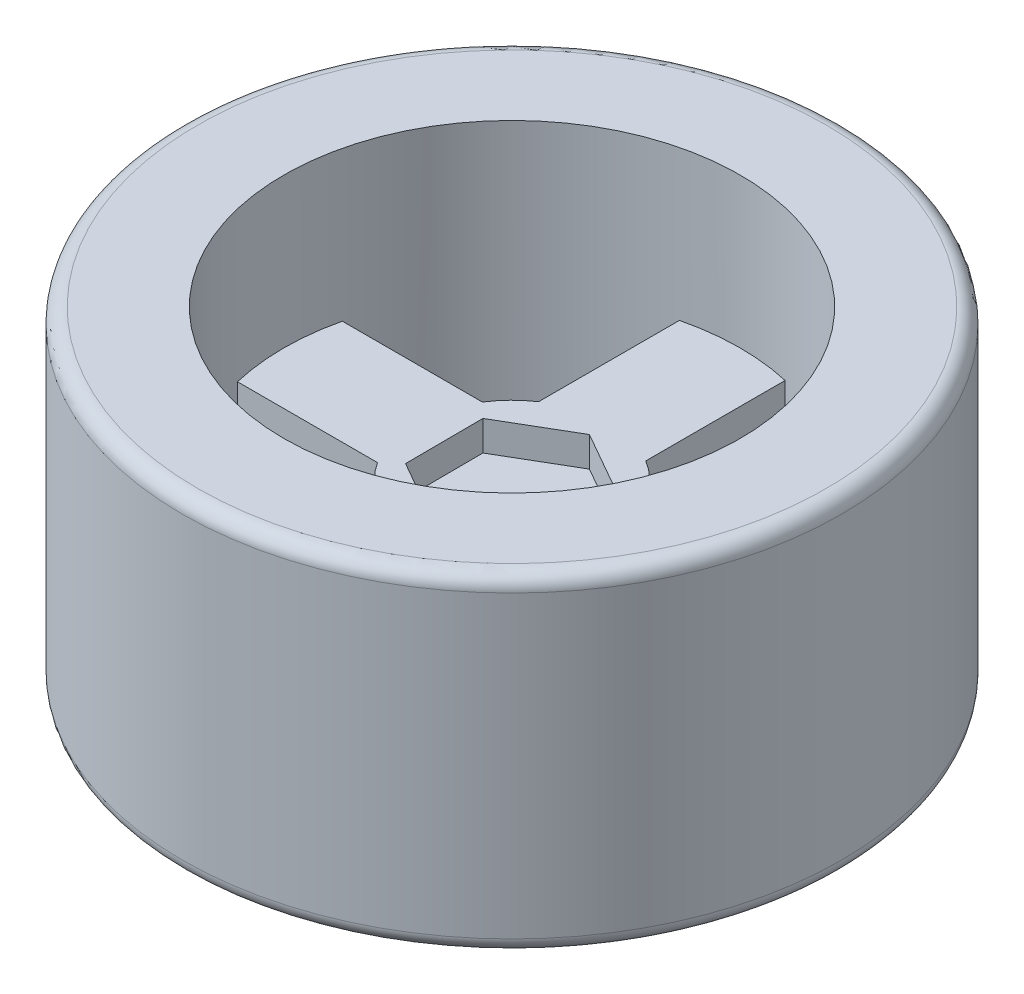
ISO-10303-21;
HEADER;
FILE_DESCRIPTION(('STEP AP214'),'2;1');
FILE_NAME('part.step','',(''),(''),'','','');
FILE_SCHEMA(('AUTOMOTIVE_DESIGN { 1 0 10303 214 1 1 1 1 }'));
ENDSEC;
DATA;
#1=APPLICATION_CONTEXT('core data for automotive mechanical design processes');
#2=APPLICATION_PROTOCOL_DEFINITION('international standard','automotive_design',2000,#1);
#3=PRODUCT_CONTEXT('',#1,'mechanical');
#4=PRODUCT('Part','Part','',(#3));
#5=PRODUCT_RELATED_PRODUCT_CATEGORY('part','',(#4));
#6=PRODUCT_DEFINITION_FORMATION('','',#4);
#7=PRODUCT_DEFINITION_CONTEXT('part definition',#1,'design');
#8=PRODUCT_DEFINITION('design','',#6,#7);
#9=PRODUCT_DEFINITION_SHAPE('','',#8);
#10=(LENGTH_UNIT() NAMED_UNIT(*) SI_UNIT(.MILLI.,.METRE.));
#11=(NAMED_UNIT(*) PLANE_ANGLE_UNIT() SI_UNIT($,.RADIAN.));
#12=(NAMED_UNIT(*) SI_UNIT($,.STERADIAN.) SOLID_ANGLE_UNIT());
#13=UNCERTAINTY_MEASURE_WITH_UNIT(LENGTH_MEASURE(1.E-05),#10,'distance_accuracy_value','');
#14=(GEOMETRIC_REPRESENTATION_CONTEXT(3) GLOBAL_UNCERTAINTY_ASSIGNED_CONTEXT((#13)) GLOBAL_UNIT_ASSIGNED_CONTEXT((#10,
#11,#12)) REPRESENTATION_CONTEXT('',''));
#15=CARTESIAN_POINT('',(0.,0.,0.));
#16=DIRECTION('',(0.,0.,1.));
#17=DIRECTION('',(1.,0.,0.));
#18=AXIS2_PLACEMENT_3D('',#15,#16,#17);
#19=CARTESIAN_POINT('',(-0.0495143622985137,12.,-2.83261216182676));
#20=DIRECTION('',(0.,-1.,0.));
#21=DIRECTION('',(0.,0.,-1.));
#22=AXIS2_PLACEMENT_3D('',#19,#20,#21);
#23=CYLINDRICAL_SURFACE('',#22,1.5);
#24=CARTESIAN_POINT('',(-0.0495143622985137,6.,-2.83261216182676));
#25=DIRECTION('',(0.,-1.,0.));
#26=DIRECTION('',(0.,0.,-1.));
#27=AXIS2_PLACEMENT_3D('',#24,#25,#26);
#28=CIRCLE('',#27,1.5);
#29=CARTESIAN_POINT('',(-0.0495143622985137,6.,-4.33261216182675));
#30=VERTEX_POINT('',#29);
#31=EDGE_CURVE('E268',#30,#30,#28,.F.);
#32=ORIENTED_EDGE('',*,*,#31,.F.);
#33=EDGE_LOOP('',(#32));
#34=FACE_BOUND('',#33,.T.);
#35=CARTESIAN_POINT('',(-0.0495143622985137,10.,-2.83261216182676));
#36=DIRECTION('',(0.,1.,0.));
#37=DIRECTION('',(0.,0.,1.));
#38=AXIS2_PLACEMENT_3D('',#35,#36,#37);
#39=CIRCLE('',#38,1.5);
#40=CARTESIAN_POINT('',(-0.0495143622985137,10.,-1.33261216182676));
#41=VERTEX_POINT('',#40);
#42=EDGE_CURVE('E257',#41,#41,#39,.F.);
#43=ORIENTED_EDGE('',*,*,#42,.F.);
#44=EDGE_LOOP('',(#43));
#45=FACE_BOUND('',#44,.T.);
#46=ADVANCED_FACE('F58',(#34,#45),#23,.F.);
#47=CARTESIAN_POINT('',(-0.0495140644693574,22.,-2.83261242169505));
#48=DIRECTION('',(0.,-1.,0.));
#49=DIRECTION('',(0.,0.,-1.));
#50=AXIS2_PLACEMENT_3D('',#47,#48,#49);
#51=CYLINDRICAL_SURFACE('',#50,15.2360201030998);
#52=DIRECTION('',(0.,-1.,0.));
#53=VECTOR('',#52,1.);
#54=CARTESIAN_POINT('',(14.7790495797042,12.,0.667387838173245));
#55=LINE('',#54,#53);
#56=CARTESIAN_POINT('',(14.7790495797042,12.,0.667387838173245));
#57=VERTEX_POINT('',#56);
#58=CARTESIAN_POINT('',(14.7790495797042,0.,0.667387838173245));
#59=VERTEX_POINT('',#58);
#60=EDGE_CURVE('E340',#57,#59,#55,.T.);
#61=ORIENTED_EDGE('',*,*,#60,.T.);
#62=CARTESIAN_POINT('',(-0.0495140644693574,0.,-2.83261242169505));
#63=DIRECTION('',(0.,1.,0.));
#64=DIRECTION('',(0.,0.,1.));
#65=AXIS2_PLACEMENT_3D('',#62,#63,#64);
#66=CIRCLE('',#65,15.2360201030998);
#67=CARTESIAN_POINT('',(3.32867889200628,0.,12.0241746108662));
#68=VERTEX_POINT('',#67);
#69=EDGE_CURVE('E384',#68,#59,#66,.T.);
#70=ORIENTED_EDGE('',*,*,#69,.F.);
#71=DIRECTION('',(0.,-1.,0.));
#72=VECTOR('',#71,1.);
#73=CARTESIAN_POINT('',(3.32867889200628,12.,12.024174803013));
#74=LINE('',#73,#72);
#75=CARTESIAN_POINT('',(3.32867889200628,12.,12.024174803013));
#76=VERTEX_POINT('',#75);
#77=EDGE_CURVE('E373',#76,#68,#74,.T.);
#78=ORIENTED_EDGE('',*,*,#77,.F.);
#79=CARTESIAN_POINT('',(-0.0495143622985137,12.,-2.83261216182676));
#80=DIRECTION('',(0.,-1.,0.));
#81=DIRECTION('',(0.,0.,-1.));
#82=AXIS2_PLACEMENT_3D('',#79,#80,#81);
#83=CIRCLE('',#82,15.2360201030998);
#84=CARTESIAN_POINT('',(-3.67132110799372,12.,11.9666724316561));
#85=VERTEX_POINT('',#84);
#86=EDGE_CURVE('E281',#76,#85,#83,.T.);
#87=ORIENTED_EDGE('',*,*,#86,.T.);
#88=DIRECTION('',(0.,-1.,0.));
#89=VECTOR('',#88,1.);
#90=CARTESIAN_POINT('',(-3.67132110799372,12.,11.9666724316561));
#91=LINE('',#90,#89);
#92=CARTESIAN_POINT('',(-3.67132110799372,0.,11.9666724316561));
#93=VERTEX_POINT('',#92);
#94=EDGE_CURVE('E370',#85,#93,#91,.T.);
#95=ORIENTED_EDGE('',*,*,#94,.T.);
#96=CARTESIAN_POINT('',(-14.8780779451351,0.,0.667387838173244));
#97=VERTEX_POINT('',#96);
#98=EDGE_CURVE('E343',#97,#93,#66,.T.);
#99=ORIENTED_EDGE('',*,*,#98,.F.);
#100=DIRECTION('',(0.,-1.,0.));
#101=VECTOR('',#100,1.);
#102=CARTESIAN_POINT('',(-14.8780783043012,12.,0.667387838173244));
#103=LINE('',#102,#101);
#104=CARTESIAN_POINT('',(-14.8780783043012,12.,0.667387838173244));
#105=VERTEX_POINT('',#104);
#106=EDGE_CURVE('E364',#105,#97,#103,.T.);
#107=ORIENTED_EDGE('',*,*,#106,.F.);
#108=CARTESIAN_POINT('',(-14.8780783043012,12.,-6.33261216182675));
#109=VERTEX_POINT('',#108);
#110=EDGE_CURVE('E286',#105,#109,#83,.T.);
#111=ORIENTED_EDGE('',*,*,#110,.T.);
#112=DIRECTION('',(0.,-1.,0.));
#113=VECTOR('',#112,1.);
#114=CARTESIAN_POINT('',(-14.8780783043012,12.,-6.33261216182675));
#115=LINE('',#114,#113);
#116=CARTESIAN_POINT('',(-14.8780783043012,0.,-6.33261216182675));
#117=VERTEX_POINT('',#116);
#118=EDGE_CURVE('E361',#109,#117,#115,.T.);
#119=ORIENTED_EDGE('',*,*,#118,.T.);
#120=CARTESIAN_POINT('',(-3.67132110799372,0.,-17.6318969422906));
#121=VERTEX_POINT('',#120);
#122=EDGE_CURVE('E723',#121,#117,#66,.T.);
#123=ORIENTED_EDGE('',*,*,#122,.F.);
#124=DIRECTION('',(0.,-1.,0.));
#125=VECTOR('',#124,1.);
#126=CARTESIAN_POINT('',(-3.67132110799372,12.,-17.6318967553096));
#127=LINE('',#126,#125);
#128=CARTESIAN_POINT('',(-3.67132110799372,12.,-17.6318967553096));
#129=VERTEX_POINT('',#128);
#130=EDGE_CURVE('E354',#129,#121,#127,.T.);
#131=ORIENTED_EDGE('',*,*,#130,.F.);
#132=CARTESIAN_POINT('',(3.32867889200627,12.,-17.6893991266665));
#133=VERTEX_POINT('',#132);
#134=EDGE_CURVE('E303',#129,#133,#83,.T.);
#135=ORIENTED_EDGE('',*,*,#134,.T.);
#136=DIRECTION('',(0.,-1.,0.));
#137=VECTOR('',#136,1.);
#138=CARTESIAN_POINT('',(3.32867889200627,12.,-17.6893991266665));
#139=LINE('',#138,#137);
#140=CARTESIAN_POINT('',(3.32867889200627,0.,-17.6893991266665));
#141=VERTEX_POINT('',#140);
#142=EDGE_CURVE('E351',#133,#141,#139,.T.);
#143=ORIENTED_EDGE('',*,*,#142,.T.);
#144=CARTESIAN_POINT('',(14.7790499388703,0.,-6.33261216182675));
#145=VERTEX_POINT('',#144);
#146=EDGE_CURVE('E387',#145,#141,#66,.T.);
#147=ORIENTED_EDGE('',*,*,#146,.F.);
#148=DIRECTION('',(0.,-1.,0.));
#149=VECTOR('',#148,1.);
#150=CARTESIAN_POINT('',(14.7790495797042,12.,-6.33261216182675));
#151=LINE('',#150,#149);
#152=CARTESIAN_POINT('',(14.7790495797042,12.,-6.33261216182675));
#153=VERTEX_POINT('',#152);
#154=EDGE_CURVE('E344',#153,#145,#151,.T.);
#155=ORIENTED_EDGE('',*,*,#154,.F.);
#156=EDGE_CURVE('E285',#153,#57,#83,.T.);
#157=ORIENTED_EDGE('',*,*,#156,.T.);
#158=EDGE_LOOP('',(#61,#70,#78,#87,#95,#99,#107,#111,#119,#123,#131,#135,#143,#147,#155,#157));
#159=FACE_BOUND('',#158,.T.);
#160=CARTESIAN_POINT('',(-0.0495140644693574,22.,-2.83261242169505));
#161=DIRECTION('',(0.,1.,0.));
#162=DIRECTION('',(0.,0.,1.));
#163=AXIS2_PLACEMENT_3D('',#160,#161,#162);
#164=CIRCLE('',#163,15.2360201030998);
#165=CARTESIAN_POINT('',(-0.0495140644693574,22.,12.4034076814048));
#166=VERTEX_POINT('',#165);
#167=EDGE_CURVE('E380',#166,#166,#164,.T.);
#168=ORIENTED_EDGE('',*,*,#167,.T.);
#169=EDGE_LOOP('',(#168));
#170=FACE_BOUND('',#169,.T.);
#171=ADVANCED_FACE('F411',(#159,#170),#51,.F.);
#172=CARTESIAN_POINT('',(0.,0.,0.));
#173=DIRECTION('',(0.,1.,0.));
#174=DIRECTION('',(0.,0.,1.));
#175=AXIS2_PLACEMENT_3D('',#172,#173,#174);
#176=PLANE('',#175);
#177=CARTESIAN_POINT('',(-0.0495140644693574,0.,-2.83261242169505));
#178=DIRECTION('',(0.,1.,0.));
#179=DIRECTION('',(0.,0.,1.));
#180=AXIS2_PLACEMENT_3D('',#177,#178,#179);
#181=CIRCLE('',#180,21.);
#182=CARTESIAN_POINT('',(-0.0495140644693574,0.,18.1673875783049));
#183=VERTEX_POINT('',#182);
#184=EDGE_CURVE('E12',#183,#183,#181,.F.);
#185=ORIENTED_EDGE('',*,*,#184,.T.);
#186=EDGE_LOOP('',(#185));
#187=FACE_BOUND('',#186,.T.);
#188=CARTESIAN_POINT('',(-0.0495143622985137,0.,-2.83261216182676));
#189=DIRECTION('',(0.,-1.,0.));
#190=DIRECTION('',(0.,0.,-1.));
#191=AXIS2_PLACEMENT_3D('',#188,#189,#190);
#192=CIRCLE('',#191,4.9908186978438);
#193=CARTESIAN_POINT('',(-0.0495143622985137,0.,-7.82343085967055));
#194=VERTEX_POINT('',#193);
#195=EDGE_CURVE('E269',#194,#194,#192,.T.);
#196=ORIENTED_EDGE('',*,*,#195,.F.);
#197=EDGE_LOOP('',(#196));
#198=FACE_BOUND('',#197,.T.);
#199=ORIENTED_EDGE('',*,*,#69,.T.);
#200=DIRECTION('',(-1.,0.,0.));
#201=VECTOR('',#200,1.);
#202=CARTESIAN_POINT('',(0.,0.,0.667387838173245));
#203=LINE('',#202,#201);
#204=CARTESIAN_POINT('',(5.42771121275315,0.,0.667387838173245));
#205=VERTEX_POINT('',#204);
#206=EDGE_CURVE('E311',#59,#205,#203,.T.);
#207=ORIENTED_EDGE('',*,*,#206,.T.);
#208=CARTESIAN_POINT('',(-0.0495143622985137,0.,-2.83261216182676));
#209=DIRECTION('',(0.,-1.,0.));
#210=DIRECTION('',(0.,0.,-1.));
#211=AXIS2_PLACEMENT_3D('',#208,#209,#210);
#212=CIRCLE('',#211,6.5);
#213=CARTESIAN_POINT('',(3.32867889200628,0.,2.72056803843414));
#214=VERTEX_POINT('',#213);
#215=EDGE_CURVE('E314',#205,#214,#212,.T.);
#216=ORIENTED_EDGE('',*,*,#215,.T.);
#217=DIRECTION('',(0.,0.,-1.));
#218=VECTOR('',#217,1.);
#219=CARTESIAN_POINT('',(3.32867889200628,0.,0.));
#220=LINE('',#219,#218);
#221=EDGE_CURVE('E317',#68,#214,#220,.T.);
#222=ORIENTED_EDGE('',*,*,#221,.F.);
#223=EDGE_LOOP('',(#199,#207,#216,#222));
#224=FACE_BOUND('',#223,.T.);
#225=ORIENTED_EDGE('',*,*,#146,.T.);
#226=DIRECTION('',(0.,0.,-1.));
#227=VECTOR('',#226,1.);
#228=CARTESIAN_POINT('',(3.32867889200627,0.,0.));
#229=LINE('',#228,#227);
#230=CARTESIAN_POINT('',(3.32867889200627,0.,-8.38579236208765));
#231=VERTEX_POINT('',#230);
#232=EDGE_CURVE('E333',#231,#141,#229,.T.);
#233=ORIENTED_EDGE('',*,*,#232,.F.);
#234=CARTESIAN_POINT('',(-0.0495143622985137,0.,-2.83261216182676));
#235=DIRECTION('',(0.,-1.,0.));
#236=DIRECTION('',(0.,0.,-1.));
#237=AXIS2_PLACEMENT_3D('',#234,#235,#236);
#238=CIRCLE('',#237,6.5);
#239=CARTESIAN_POINT('',(5.42771121275315,0.,-6.33261216182676));
#240=VERTEX_POINT('',#239);
#241=EDGE_CURVE('E335',#231,#240,#238,.T.);
#242=ORIENTED_EDGE('',*,*,#241,.T.);
#243=DIRECTION('',(-1.,0.,0.));
#244=VECTOR('',#243,1.);
#245=CARTESIAN_POINT('',(0.,0.,-6.33261216182676));
#246=LINE('',#245,#244);
#247=EDGE_CURVE('E276',#145,#240,#246,.T.);
#248=ORIENTED_EDGE('',*,*,#247,.F.);
#249=EDGE_LOOP('',(#225,#233,#242,#248));
#250=FACE_BOUND('',#249,.T.);
#251=ORIENTED_EDGE('',*,*,#122,.T.);
#252=DIRECTION('',(-1.,0.,0.));
#253=VECTOR('',#252,1.);
#254=CARTESIAN_POINT('',(0.,0.,-6.33261216182675));
#255=LINE('',#254,#253);
#256=CARTESIAN_POINT('',(-5.52673993735018,0.,-6.33261216182675));
#257=VERTEX_POINT('',#256);
#258=EDGE_CURVE('E326',#257,#117,#255,.T.);
#259=ORIENTED_EDGE('',*,*,#258,.F.);
#260=CARTESIAN_POINT('',(-0.0495143622985137,0.,-2.83261216182676));
#261=DIRECTION('',(0.,-1.,0.));
#262=DIRECTION('',(0.,0.,-1.));
#263=AXIS2_PLACEMENT_3D('',#260,#261,#262);
#264=CIRCLE('',#263,6.5);
#265=CARTESIAN_POINT('',(-3.67132110799372,0.,-8.23006673753526));
#266=VERTEX_POINT('',#265);
#267=EDGE_CURVE('E328',#257,#266,#264,.T.);
#268=ORIENTED_EDGE('',*,*,#267,.T.);
#269=DIRECTION('',(0.,0.,-1.));
#270=VECTOR('',#269,1.);
#271=CARTESIAN_POINT('',(-3.67132110799372,0.,0.));
#272=LINE('',#271,#270);
#273=EDGE_CURVE('E331',#266,#121,#272,.T.);
#274=ORIENTED_EDGE('',*,*,#273,.T.);
#275=EDGE_LOOP('',(#251,#259,#268,#274));
#276=FACE_BOUND('',#275,.T.);
#277=DIRECTION('',(-1.,0.,0.));
#278=VECTOR('',#277,1.);
#279=CARTESIAN_POINT('',(0.,0.,0.667387838173244));
#280=LINE('',#279,#278);
#281=CARTESIAN_POINT('',(-5.52673993735018,0.,0.667387838173244));
#282=VERTEX_POINT('',#281);
#283=EDGE_CURVE('E81',#282,#97,#280,.T.);
#284=ORIENTED_EDGE('',*,*,#283,.T.);
#285=ORIENTED_EDGE('',*,*,#98,.T.);
#286=DIRECTION('',(0.,0.,-1.));
#287=VECTOR('',#286,1.);
#288=CARTESIAN_POINT('',(-3.67132110799372,0.,0.));
#289=LINE('',#288,#287);
#290=CARTESIAN_POINT('',(-3.67132110799372,0.,2.56484241388175));
#291=VERTEX_POINT('',#290);
#292=EDGE_CURVE('E320',#93,#291,#289,.T.);
#293=ORIENTED_EDGE('',*,*,#292,.T.);
#294=CARTESIAN_POINT('',(-0.0495143622985137,0.,-2.83261216182676));
#295=DIRECTION('',(0.,-1.,0.));
#296=DIRECTION('',(0.,0.,-1.));
#297=AXIS2_PLACEMENT_3D('',#294,#295,#296);
#298=CIRCLE('',#297,6.5);
#299=EDGE_CURVE('E323',#291,#282,#298,.T.);
#300=ORIENTED_EDGE('',*,*,#299,.T.);
#301=EDGE_LOOP('',(#284,#285,#293,#300));
#302=FACE_BOUND('',#301,.T.);
#303=ADVANCED_FACE('F417',(#187,#198,#224,#250,#276,#302),#176,.F.);
#304=CARTESIAN_POINT('',(-0.0495140644693574,22.,-2.83261242169505));
#305=DIRECTION('',(0.,-1.,0.));
#306=DIRECTION('',(0.,0.,-1.));
#307=AXIS2_PLACEMENT_3D('',#304,#305,#306);
#308=CYLINDRICAL_SURFACE('',#307,22.);
#309=CARTESIAN_POINT('',(-0.0495140644693574,1.,-2.83261242169505));
#310=DIRECTION('',(0.,1.,0.));
#311=DIRECTION('',(0.,0.,1.));
#312=AXIS2_PLACEMENT_3D('',#309,#310,#311);
#313=CIRCLE('',#312,22.);
#314=CARTESIAN_POINT('',(-0.0495140644693574,1.,19.1673875783049));
#315=VERTEX_POINT('',#314);
#316=EDGE_CURVE('E66',#315,#315,#313,.T.);
#317=ORIENTED_EDGE('',*,*,#316,.T.);
#318=EDGE_LOOP('',(#317));
#319=FACE_BOUND('',#318,.T.);
#320=CARTESIAN_POINT('',(-0.0495140644693574,21.,-2.83261242169505));
#321=DIRECTION('',(0.,1.,0.));
#322=DIRECTION('',(0.,0.,1.));
#323=AXIS2_PLACEMENT_3D('',#320,#321,#322);
#324=CIRCLE('',#323,22.);
#325=CARTESIAN_POINT('',(-0.0495140644693574,21.,19.1673875783049));
#326=VERTEX_POINT('',#325);
#327=EDGE_CURVE('E394',#326,#326,#324,.F.);
#328=ORIENTED_EDGE('',*,*,#327,.T.);
#329=EDGE_LOOP('',(#328));
#330=FACE_BOUND('',#329,.T.);
#331=ADVANCED_FACE('F399',(#319,#330),#308,.T.);
#332=CARTESIAN_POINT('',(0.,22.,0.));
#333=DIRECTION('',(0.,1.,0.));
#334=DIRECTION('',(0.,0.,1.));
#335=AXIS2_PLACEMENT_3D('',#332,#333,#334);
#336=PLANE('',#335);
#337=CARTESIAN_POINT('',(-0.0495140644693574,22.,-2.83261242169505));
#338=DIRECTION('',(0.,1.,0.));
#339=DIRECTION('',(0.,0.,1.));
#340=AXIS2_PLACEMENT_3D('',#337,#338,#339);
#341=CIRCLE('',#340,21.);
#342=CARTESIAN_POINT('',(-0.0495140644693574,22.,18.1673875783049));
#343=VERTEX_POINT('',#342);
#344=EDGE_CURVE('E383',#343,#343,#341,.T.);
#345=ORIENTED_EDGE('',*,*,#344,.T.);
#346=EDGE_LOOP('',(#345));
#347=FACE_BOUND('',#346,.T.);
#348=ORIENTED_EDGE('',*,*,#167,.F.);
#349=EDGE_LOOP('',(#348));
#350=FACE_BOUND('',#349,.T.);
#351=ADVANCED_FACE('F426',(#347,#350),#336,.T.);
#352=CARTESIAN_POINT('',(0.,12.,0.667387838173245));
#353=DIRECTION('',(0.,0.,1.));
#354=DIRECTION('',(1.,0.,0.));
#355=AXIS2_PLACEMENT_3D('',#352,#353,#354);
#356=PLANE('',#355);
#357=ORIENTED_EDGE('',*,*,#206,.F.);
#358=ORIENTED_EDGE('',*,*,#60,.F.);
#359=DIRECTION('',(-1.,0.,0.));
#360=VECTOR('',#359,1.);
#361=CARTESIAN_POINT('',(0.,12.,0.667387838173245));
#362=LINE('',#361,#360);
#363=CARTESIAN_POINT('',(5.42771121275315,12.,0.667387838173245));
#364=VERTEX_POINT('',#363);
#365=EDGE_CURVE('E272',#57,#364,#362,.T.);
#366=ORIENTED_EDGE('',*,*,#365,.T.);
#367=DIRECTION('',(0.,-1.,0.));
#368=VECTOR('',#367,1.);
#369=CARTESIAN_POINT('',(5.42771121275315,12.,0.667387838173245));
#370=LINE('',#369,#368);
#371=EDGE_CURVE('E378',#364,#205,#370,.T.);
#372=ORIENTED_EDGE('',*,*,#371,.T.);
#373=EDGE_LOOP('',(#357,#358,#366,#372));
#374=FACE_BOUND('',#373,.T.);
#375=ADVANCED_FACE('F424',(#374),#356,.T.);
#376=CARTESIAN_POINT('',(0.,12.,-6.33261216182676));
#377=DIRECTION('',(0.,0.,1.));
#378=DIRECTION('',(1.,0.,0.));
#379=AXIS2_PLACEMENT_3D('',#376,#377,#378);
#380=PLANE('',#379);
#381=ORIENTED_EDGE('',*,*,#247,.T.);
#382=DIRECTION('',(0.,-1.,0.));
#383=VECTOR('',#382,1.);
#384=CARTESIAN_POINT('',(5.42771121275315,12.,-6.33261216182676));
#385=LINE('',#384,#383);
#386=CARTESIAN_POINT('',(5.42771121275315,12.,-6.33261216182676));
#387=VERTEX_POINT('',#386);
#388=EDGE_CURVE('E347',#387,#240,#385,.T.);
#389=ORIENTED_EDGE('',*,*,#388,.F.);
#390=DIRECTION('',(-1.,0.,0.));
#391=VECTOR('',#390,1.);
#392=CARTESIAN_POINT('',(0.,12.,-6.33261216182676));
#393=LINE('',#392,#391);
#394=EDGE_CURVE('E309',#153,#387,#393,.T.);
#395=ORIENTED_EDGE('',*,*,#394,.F.);
#396=ORIENTED_EDGE('',*,*,#154,.T.);
#397=EDGE_LOOP('',(#381,#389,#395,#396));
#398=FACE_BOUND('',#397,.T.);
#399=ADVANCED_FACE('F450',(#398),#380,.F.);
#400=CARTESIAN_POINT('',(-0.0495143622985137,12.,-2.83261216182676));
#401=DIRECTION('',(0.,-1.,0.));
#402=DIRECTION('',(0.,0.,-1.));
#403=AXIS2_PLACEMENT_3D('',#400,#401,#402);
#404=CYLINDRICAL_SURFACE('',#403,6.5);
#405=ORIENTED_EDGE('',*,*,#241,.F.);
#406=DIRECTION('',(0.,-1.,0.));
#407=VECTOR('',#406,1.);
#408=CARTESIAN_POINT('',(3.32867889200627,12.,-8.38579236208765));
#409=LINE('',#408,#407);
#410=CARTESIAN_POINT('',(3.32867889200627,12.,-8.38579236208765));
#411=VERTEX_POINT('',#410);
#412=EDGE_CURVE('E349',#411,#231,#409,.T.);
#413=ORIENTED_EDGE('',*,*,#412,.F.);
#414=CARTESIAN_POINT('',(-0.0495143622985137,12.,-2.83261216182676));
#415=DIRECTION('',(0.,-1.,0.));
#416=DIRECTION('',(0.,0.,-1.));
#417=AXIS2_PLACEMENT_3D('',#414,#415,#416);
#418=CIRCLE('',#417,6.5);
#419=EDGE_CURVE('E306',#411,#387,#418,.T.);
#420=ORIENTED_EDGE('',*,*,#419,.T.);
#421=ORIENTED_EDGE('',*,*,#388,.T.);
#422=EDGE_LOOP('',(#405,#413,#420,#421));
#423=FACE_BOUND('',#422,.T.);
#424=ADVANCED_FACE('F458',(#423),#404,.T.);
#425=CARTESIAN_POINT('',(3.32867889200627,12.,0.));
#426=DIRECTION('',(-1.,0.,0.));
#427=DIRECTION('',(0.,0.,1.));
#428=AXIS2_PLACEMENT_3D('',#425,#426,#427);
#429=PLANE('',#428);
#430=ORIENTED_EDGE('',*,*,#232,.T.);
#431=ORIENTED_EDGE('',*,*,#142,.F.);
#432=DIRECTION('',(0.,0.,-1.));
#433=VECTOR('',#432,1.);
#434=CARTESIAN_POINT('',(3.32867889200627,12.,0.));
#435=LINE('',#434,#433);
#436=EDGE_CURVE('E304',#411,#133,#435,.T.);
#437=ORIENTED_EDGE('',*,*,#436,.F.);
#438=ORIENTED_EDGE('',*,*,#412,.T.);
#439=EDGE_LOOP('',(#430,#431,#437,#438));
#440=FACE_BOUND('',#439,.T.);
#441=ADVANCED_FACE('F466',(#440),#429,.F.);
#442=CARTESIAN_POINT('',(-3.67132110799372,12.,0.));
#443=DIRECTION('',(-1.,0.,0.));
#444=DIRECTION('',(0.,0.,1.));
#445=AXIS2_PLACEMENT_3D('',#442,#443,#444);
#446=PLANE('',#445);
#447=ORIENTED_EDGE('',*,*,#273,.F.);
#448=DIRECTION('',(0.,-1.,0.));
#449=VECTOR('',#448,1.);
#450=CARTESIAN_POINT('',(-3.67132110799372,12.,-8.23006673753526));
#451=LINE('',#450,#449);
#452=CARTESIAN_POINT('',(-3.67132110799372,12.,-8.23006673753526));
#453=VERTEX_POINT('',#452);
#454=EDGE_CURVE('E357',#453,#266,#451,.T.);
#455=ORIENTED_EDGE('',*,*,#454,.F.);
#456=DIRECTION('',(0.,0.,-1.));
#457=VECTOR('',#456,1.);
#458=CARTESIAN_POINT('',(-3.67132110799372,12.,0.));
#459=LINE('',#458,#457);
#460=EDGE_CURVE('E300',#453,#129,#459,.T.);
#461=ORIENTED_EDGE('',*,*,#460,.T.);
#462=ORIENTED_EDGE('',*,*,#130,.T.);
#463=EDGE_LOOP('',(#447,#455,#461,#462));
#464=FACE_BOUND('',#463,.T.);
#465=ADVANCED_FACE('F474',(#464),#446,.T.);
#466=CARTESIAN_POINT('',(-0.0495143622985137,12.,-2.83261216182676));
#467=DIRECTION('',(0.,-1.,0.));
#468=DIRECTION('',(0.,0.,-1.));
#469=AXIS2_PLACEMENT_3D('',#466,#467,#468);
#470=CYLINDRICAL_SURFACE('',#469,6.5);
#471=ORIENTED_EDGE('',*,*,#267,.F.);
#472=DIRECTION('',(0.,-1.,0.));
#473=VECTOR('',#472,1.);
#474=CARTESIAN_POINT('',(-5.52673993735018,12.,-6.33261216182675));
#475=LINE('',#474,#473);
#476=CARTESIAN_POINT('',(-5.52673993735018,12.,-6.33261216182675));
#477=VERTEX_POINT('',#476);
#478=EDGE_CURVE('E359',#477,#257,#475,.T.);
#479=ORIENTED_EDGE('',*,*,#478,.F.);
#480=CARTESIAN_POINT('',(-0.0495143622985137,12.,-2.83261216182676));
#481=DIRECTION('',(0.,-1.,0.));
#482=DIRECTION('',(0.,0.,-1.));
#483=AXIS2_PLACEMENT_3D('',#480,#481,#482);
#484=CIRCLE('',#483,6.5);
#485=EDGE_CURVE('E297',#477,#453,#484,.T.);
#486=ORIENTED_EDGE('',*,*,#485,.T.);
#487=ORIENTED_EDGE('',*,*,#454,.T.);
#488=EDGE_LOOP('',(#471,#479,#486,#487));
#489=FACE_BOUND('',#488,.T.);
#490=ADVANCED_FACE('F482',(#489),#470,.T.);
#491=CARTESIAN_POINT('',(0.,12.,-6.33261216182675));
#492=DIRECTION('',(0.,0.,1.));
#493=DIRECTION('',(1.,0.,0.));
#494=AXIS2_PLACEMENT_3D('',#491,#492,#493);
#495=PLANE('',#494);
#496=ORIENTED_EDGE('',*,*,#258,.T.);
#497=ORIENTED_EDGE('',*,*,#118,.F.);
#498=DIRECTION('',(-1.,0.,0.));
#499=VECTOR('',#498,1.);
#500=CARTESIAN_POINT('',(0.,12.,-6.33261216182675));
#501=LINE('',#500,#499);
#502=EDGE_CURVE('E295',#477,#109,#501,.T.);
#503=ORIENTED_EDGE('',*,*,#502,.F.);
#504=ORIENTED_EDGE('',*,*,#478,.T.);
#505=EDGE_LOOP('',(#496,#497,#503,#504));
#506=FACE_BOUND('',#505,.T.);
#507=ADVANCED_FACE('F490',(#506),#495,.F.);
#508=CARTESIAN_POINT('',(0.,12.,0.667387838173244));
#509=DIRECTION('',(0.,0.,1.));
#510=DIRECTION('',(1.,0.,0.));
#511=AXIS2_PLACEMENT_3D('',#508,#509,#510);
#512=PLANE('',#511);
#513=ORIENTED_EDGE('',*,*,#283,.F.);
#514=DIRECTION('',(0.,-1.,0.));
#515=VECTOR('',#514,1.);
#516=CARTESIAN_POINT('',(-5.52673993735018,12.,0.667387838173244));
#517=LINE('',#516,#515);
#518=CARTESIAN_POINT('',(-5.52673993735018,12.,0.667387838173244));
#519=VERTEX_POINT('',#518);
#520=EDGE_CURVE('E366',#519,#282,#517,.T.);
#521=ORIENTED_EDGE('',*,*,#520,.F.);
#522=DIRECTION('',(-1.,0.,0.));
#523=VECTOR('',#522,1.);
#524=CARTESIAN_POINT('',(0.,12.,0.667387838173244));
#525=LINE('',#524,#523);
#526=EDGE_CURVE('E292',#519,#105,#525,.T.);
#527=ORIENTED_EDGE('',*,*,#526,.T.);
#528=ORIENTED_EDGE('',*,*,#106,.T.);
#529=EDGE_LOOP('',(#513,#521,#527,#528));
#530=FACE_BOUND('',#529,.T.);
#531=ADVANCED_FACE('F498',(#530),#512,.T.);
#532=CARTESIAN_POINT('',(-0.0495143622985137,12.,-2.83261216182676));
#533=DIRECTION('',(0.,-1.,0.));
#534=DIRECTION('',(0.,0.,-1.));
#535=AXIS2_PLACEMENT_3D('',#532,#533,#534);
#536=CYLINDRICAL_SURFACE('',#535,6.5);
#537=ORIENTED_EDGE('',*,*,#299,.F.);
#538=DIRECTION('',(0.,-1.,0.));
#539=VECTOR('',#538,1.);
#540=CARTESIAN_POINT('',(-3.67132110799372,12.,2.56484241388175));
#541=LINE('',#540,#539);
#542=CARTESIAN_POINT('',(-3.67132110799372,12.,2.56484241388175));
#543=VERTEX_POINT('',#542);
#544=EDGE_CURVE('E368',#543,#291,#541,.T.);
#545=ORIENTED_EDGE('',*,*,#544,.F.);
#546=CARTESIAN_POINT('',(-0.0495143622985137,12.,-2.83261216182676));
#547=DIRECTION('',(0.,-1.,0.));
#548=DIRECTION('',(0.,0.,-1.));
#549=AXIS2_PLACEMENT_3D('',#546,#547,#548);
#550=CIRCLE('',#549,6.5);
#551=EDGE_CURVE('E289',#543,#519,#550,.T.);
#552=ORIENTED_EDGE('',*,*,#551,.T.);
#553=ORIENTED_EDGE('',*,*,#520,.T.);
#554=EDGE_LOOP('',(#537,#545,#552,#553));
#555=FACE_BOUND('',#554,.T.);
#556=ADVANCED_FACE('F506',(#555),#536,.T.);
#557=CARTESIAN_POINT('',(-3.67132110799372,12.,0.));
#558=DIRECTION('',(-1.,0.,0.));
#559=DIRECTION('',(0.,0.,1.));
#560=AXIS2_PLACEMENT_3D('',#557,#558,#559);
#561=PLANE('',#560);
#562=ORIENTED_EDGE('',*,*,#292,.F.);
#563=ORIENTED_EDGE('',*,*,#94,.F.);
#564=DIRECTION('',(0.,0.,-1.));
#565=VECTOR('',#564,1.);
#566=CARTESIAN_POINT('',(-3.67132110799372,12.,0.));
#567=LINE('',#566,#565);
#568=EDGE_CURVE('E284',#85,#543,#567,.T.);
#569=ORIENTED_EDGE('',*,*,#568,.T.);
#570=ORIENTED_EDGE('',*,*,#544,.T.);
#571=EDGE_LOOP('',(#562,#563,#569,#570));
#572=FACE_BOUND('',#571,.T.);
#573=ADVANCED_FACE('F514',(#572),#561,.T.);
#574=CARTESIAN_POINT('',(3.32867889200628,12.,0.));
#575=DIRECTION('',(-1.,0.,0.));
#576=DIRECTION('',(0.,0.,1.));
#577=AXIS2_PLACEMENT_3D('',#574,#575,#576);
#578=PLANE('',#577);
#579=ORIENTED_EDGE('',*,*,#221,.T.);
#580=DIRECTION('',(0.,-1.,0.));
#581=VECTOR('',#580,1.);
#582=CARTESIAN_POINT('',(3.32867889200628,12.,2.72056803843414));
#583=LINE('',#582,#581);
#584=CARTESIAN_POINT('',(3.32867889200628,12.,2.72056803843414));
#585=VERTEX_POINT('',#584);
#586=EDGE_CURVE('E376',#585,#214,#583,.T.);
#587=ORIENTED_EDGE('',*,*,#586,.F.);
#588=DIRECTION('',(0.,0.,-1.));
#589=VECTOR('',#588,1.);
#590=CARTESIAN_POINT('',(3.32867889200628,12.,0.));
#591=LINE('',#590,#589);
#592=EDGE_CURVE('E279',#76,#585,#591,.T.);
#593=ORIENTED_EDGE('',*,*,#592,.F.);
#594=ORIENTED_EDGE('',*,*,#77,.T.);
#595=EDGE_LOOP('',(#579,#587,#593,#594));
#596=FACE_BOUND('',#595,.T.);
#597=ADVANCED_FACE('F522',(#596),#578,.F.);
#598=CARTESIAN_POINT('',(-0.0495143622985137,12.,-2.83261216182676));
#599=DIRECTION('',(0.,-1.,0.));
#600=DIRECTION('',(0.,0.,-1.));
#601=AXIS2_PLACEMENT_3D('',#598,#599,#600);
#602=CYLINDRICAL_SURFACE('',#601,6.5);
#603=ORIENTED_EDGE('',*,*,#215,.F.);
#604=ORIENTED_EDGE('',*,*,#371,.F.);
#605=CARTESIAN_POINT('',(-0.0495143622985137,12.,-2.83261216182676));
#606=DIRECTION('',(0.,-1.,0.));
#607=DIRECTION('',(0.,0.,-1.));
#608=AXIS2_PLACEMENT_3D('',#605,#606,#607);
#609=CIRCLE('',#608,6.5);
#610=EDGE_CURVE('E275',#364,#585,#609,.T.);
#611=ORIENTED_EDGE('',*,*,#610,.T.);
#612=ORIENTED_EDGE('',*,*,#586,.T.);
#613=EDGE_LOOP('',(#603,#604,#611,#612));
#614=FACE_BOUND('',#613,.T.);
#615=ADVANCED_FACE('F530',(#614),#602,.T.);
#616=CARTESIAN_POINT('',(0.,12.,0.));
#617=DIRECTION('',(0.,-1.,0.));
#618=DIRECTION('',(0.,0.,-1.));
#619=AXIS2_PLACEMENT_3D('',#616,#617,#618);
#620=PLANE('',#619);
#621=DIRECTION('',(0.00539781444194906,0.,0.999985431693507));
#622=VECTOR('',#621,1.);
#623=CARTESIAN_POINT('',(-4.56347244038505,12.,-5.40636061848905));
#624=LINE('',#623,#622);
#625=CARTESIAN_POINT('',(-4.56347244038505,12.,-5.40636061848905));
#626=VERTEX_POINT('',#625);
#627=CARTESIAN_POINT('',(-4.5354245737952,12.,-0.210283894923516));
#628=VERTEX_POINT('',#627);
#629=EDGE_CURVE('E245',#626,#628,#624,.T.);
#630=ORIENTED_EDGE('',*,*,#629,.F.);
#631=DIRECTION('',(-0.863313880039951,0.,0.504667360278396));
#632=VECTOR('',#631,1.);
#633=CARTESIAN_POINT('',(-0.0775619310592118,12.,-8.02868914526059));
#634=LINE('',#633,#632);
#635=CARTESIAN_POINT('',(-0.0775619310592118,12.,-8.02868914526059));
#636=VERTEX_POINT('',#635);
#637=EDGE_CURVE('E73',#636,#626,#634,.T.);
#638=ORIENTED_EDGE('',*,*,#637,.F.);
#639=DIRECTION('',(-0.8687116944819,0.,-0.495318071415111));
#640=VECTOR('',#639,1.);
#641=CARTESIAN_POINT('',(4.43639644485648,12.,-5.45494094846659));
#642=LINE('',#641,#640);
#643=CARTESIAN_POINT('',(4.43639644485648,12.,-5.45494094846659));
#644=VERTEX_POINT('',#643);
#645=EDGE_CURVE('E231',#644,#636,#642,.T.);
#646=ORIENTED_EDGE('',*,*,#645,.F.);
#647=DIRECTION('',(-0.00539781444194906,0.,-0.999985431693507));
#648=VECTOR('',#647,1.);
#649=CARTESIAN_POINT('',(4.46444431144633,12.,-0.258864224901057));
#650=LINE('',#649,#648);
#651=CARTESIAN_POINT('',(4.46444431144633,12.,-0.258864224901057));
#652=VERTEX_POINT('',#651);
#653=EDGE_CURVE('E234',#652,#644,#650,.T.);
#654=ORIENTED_EDGE('',*,*,#653,.F.);
#655=DIRECTION('',(0.863313880039951,0.,-0.504667360278396));
#656=VECTOR('',#655,1.);
#657=CARTESIAN_POINT('',(-0.0214661978795039,12.,2.36346430187048));
#658=LINE('',#657,#656);
#659=CARTESIAN_POINT('',(-0.0214661978795039,12.,2.36346430187048));
#660=VERTEX_POINT('',#659);
#661=EDGE_CURVE('E250',#660,#652,#658,.T.);
#662=ORIENTED_EDGE('',*,*,#661,.F.);
#663=DIRECTION('',(0.8687116944819,0.,0.495318071415111));
#664=VECTOR('',#663,1.);
#665=CARTESIAN_POINT('',(-4.5354245737952,12.,-0.210283894923516));
#666=LINE('',#665,#664);
#667=EDGE_CURVE('E247',#628,#660,#666,.T.);
#668=ORIENTED_EDGE('',*,*,#667,.F.);
#669=EDGE_LOOP('',(#630,#638,#646,#654,#662,#668));
#670=FACE_BOUND('',#669,.T.);
#671=ORIENTED_EDGE('',*,*,#365,.F.);
#672=ORIENTED_EDGE('',*,*,#156,.F.);
#673=ORIENTED_EDGE('',*,*,#394,.T.);
#674=ORIENTED_EDGE('',*,*,#419,.F.);
#675=ORIENTED_EDGE('',*,*,#436,.T.);
#676=ORIENTED_EDGE('',*,*,#134,.F.);
#677=ORIENTED_EDGE('',*,*,#460,.F.);
#678=ORIENTED_EDGE('',*,*,#485,.F.);
#679=ORIENTED_EDGE('',*,*,#502,.T.);
#680=ORIENTED_EDGE('',*,*,#110,.F.);
#681=ORIENTED_EDGE('',*,*,#526,.F.);
#682=ORIENTED_EDGE('',*,*,#551,.F.);
#683=ORIENTED_EDGE('',*,*,#568,.F.);
#684=ORIENTED_EDGE('',*,*,#86,.F.);
#685=ORIENTED_EDGE('',*,*,#592,.T.);
#686=ORIENTED_EDGE('',*,*,#610,.F.);
#687=EDGE_LOOP('',(#671,#672,#673,#674,#675,#676,#677,#678,#679,#680,#681,#682,#683,#684,#685,#686));
#688=FACE_BOUND('',#687,.T.);
#689=ADVANCED_FACE('F538',(#670,#688),#620,.F.);
#690=CARTESIAN_POINT('',(-0.0495143622985137,6.,-2.83261216182676));
#691=DIRECTION('',(0.,-1.,0.));
#692=DIRECTION('',(0.,0.,-1.));
#693=AXIS2_PLACEMENT_3D('',#690,#691,#692);
#694=PLANE('',#693);
#695=CARTESIAN_POINT('',(-0.0495143622985137,6.,-2.83261216182676));
#696=DIRECTION('',(0.,-1.,0.));
#697=DIRECTION('',(0.,0.,-1.));
#698=AXIS2_PLACEMENT_3D('',#695,#696,#697);
#699=CIRCLE('',#698,4.9908186978438);
#700=CARTESIAN_POINT('',(-0.0495143622985137,6.,-7.82343085967055));
#701=VERTEX_POINT('',#700);
#702=EDGE_CURVE('E265',#701,#701,#699,.T.);
#703=ORIENTED_EDGE('',*,*,#702,.T.);
#704=EDGE_LOOP('',(#703));
#705=FACE_BOUND('',#704,.T.);
#706=ORIENTED_EDGE('',*,*,#31,.T.);
#707=EDGE_LOOP('',(#706));
#708=FACE_BOUND('',#707,.T.);
#709=ADVANCED_FACE('F546',(#705,#708),#694,.T.);
#710=CARTESIAN_POINT('',(-0.0495143622985137,6.,-2.83261216182676));
#711=DIRECTION('',(0.,-1.,0.));
#712=DIRECTION('',(0.,0.,-1.));
#713=AXIS2_PLACEMENT_3D('',#710,#711,#712);
#714=CYLINDRICAL_SURFACE('',#713,4.9908186978438);
#715=ORIENTED_EDGE('',*,*,#702,.F.);
#716=EDGE_LOOP('',(#715));
#717=FACE_BOUND('',#716,.T.);
#718=ORIENTED_EDGE('',*,*,#195,.T.);
#719=EDGE_LOOP('',(#718));
#720=FACE_BOUND('',#719,.T.);
#721=ADVANCED_FACE('F554',(#717,#720),#714,.F.);
#722=CARTESIAN_POINT('',(0.,10.,0.));
#723=DIRECTION('',(0.,1.,0.));
#724=DIRECTION('',(0.,0.,1.));
#725=AXIS2_PLACEMENT_3D('',#722,#723,#724);
#726=PLANE('',#725);
#727=DIRECTION('',(-0.863313880039951,0.,0.504667360278396));
#728=VECTOR('',#727,1.);
#729=CARTESIAN_POINT('',(-0.0775619310592118,10.,-8.02868914526059));
#730=LINE('',#729,#728);
#731=CARTESIAN_POINT('',(-0.0775619310592118,10.,-8.02868914526059));
#732=VERTEX_POINT('',#731);
#733=CARTESIAN_POINT('',(-4.56347244038505,10.,-5.40636061848905));
#734=VERTEX_POINT('',#733);
#735=EDGE_CURVE('E211',#732,#734,#730,.T.);
#736=ORIENTED_EDGE('',*,*,#735,.T.);
#737=DIRECTION('',(0.00539781444194906,0.,0.999985431693507));
#738=VECTOR('',#737,1.);
#739=CARTESIAN_POINT('',(-4.56347244038505,10.,-5.40636061848905));
#740=LINE('',#739,#738);
#741=CARTESIAN_POINT('',(-4.5354245737952,10.,-0.210283894923516));
#742=VERTEX_POINT('',#741);
#743=EDGE_CURVE('E220',#734,#742,#740,.T.);
#744=ORIENTED_EDGE('',*,*,#743,.T.);
#745=DIRECTION('',(0.8687116944819,0.,0.495318071415111));
#746=VECTOR('',#745,1.);
#747=CARTESIAN_POINT('',(-4.5354245737952,10.,-0.210283894923516));
#748=LINE('',#747,#746);
#749=CARTESIAN_POINT('',(-0.0214661978795039,10.,2.36346430187048));
#750=VERTEX_POINT('',#749);
#751=EDGE_CURVE('E225',#742,#750,#748,.T.);
#752=ORIENTED_EDGE('',*,*,#751,.T.);
#753=DIRECTION('',(0.863313880039951,0.,-0.504667360278396));
#754=VECTOR('',#753,1.);
#755=CARTESIAN_POINT('',(-0.0214661978795039,10.,2.36346430187048));
#756=LINE('',#755,#754);
#757=CARTESIAN_POINT('',(4.46444431144633,10.,-0.258864224901057));
#758=VERTEX_POINT('',#757);
#759=EDGE_CURVE('E238',#750,#758,#756,.T.);
#760=ORIENTED_EDGE('',*,*,#759,.T.);
#761=DIRECTION('',(-0.00539781444194906,0.,-0.999985431693507));
#762=VECTOR('',#761,1.);
#763=CARTESIAN_POINT('',(4.46444431144633,10.,-0.258864224901057));
#764=LINE('',#763,#762);
#765=CARTESIAN_POINT('',(4.43639644485648,10.,-5.45494094846659));
#766=VERTEX_POINT('',#765);
#767=EDGE_CURVE('E241',#758,#766,#764,.T.);
#768=ORIENTED_EDGE('',*,*,#767,.T.);
#769=DIRECTION('',(-0.8687116944819,0.,-0.495318071415111));
#770=VECTOR('',#769,1.);
#771=CARTESIAN_POINT('',(4.43639644485648,10.,-5.45494094846659));
#772=LINE('',#771,#770);
#773=EDGE_CURVE('E217',#766,#732,#772,.T.);
#774=ORIENTED_EDGE('',*,*,#773,.T.);
#775=EDGE_LOOP('',(#736,#744,#752,#760,#768,#774));
#776=FACE_BOUND('',#775,.T.);
#777=ORIENTED_EDGE('',*,*,#42,.T.);
#778=EDGE_LOOP('',(#777));
#779=FACE_BOUND('',#778,.T.);
#780=ADVANCED_FACE('F227',(#776,#779),#726,.T.);
#781=CARTESIAN_POINT('',(-0.0775619310592118,10.,-8.02868914526059));
#782=DIRECTION('',(-0.504667360278396,0.,-0.863313880039951));
#783=DIRECTION('',(-0.863313880039951,0.,0.504667360278396));
#784=AXIS2_PLACEMENT_3D('',#781,#782,#783);
#785=PLANE('',#784);
#786=ORIENTED_EDGE('',*,*,#637,.T.);
#787=DIRECTION('',(0.,1.,0.));
#788=VECTOR('',#787,1.);
#789=CARTESIAN_POINT('',(-4.56347244038505,10.,-5.40636061848905));
#790=LINE('',#789,#788);
#791=EDGE_CURVE('E207',#734,#626,#790,.T.);
#792=ORIENTED_EDGE('',*,*,#791,.F.);
#793=ORIENTED_EDGE('',*,*,#735,.F.);
#794=DIRECTION('',(0.,1.,0.));
#795=VECTOR('',#794,1.);
#796=CARTESIAN_POINT('',(-0.0775619310592118,10.,-8.02868914526059));
#797=LINE('',#796,#795);
#798=EDGE_CURVE('E255',#732,#636,#797,.T.);
#799=ORIENTED_EDGE('',*,*,#798,.T.);
#800=EDGE_LOOP('',(#786,#792,#793,#799));
#801=FACE_BOUND('',#800,.T.);
#802=ADVANCED_FACE('F209',(#801),#785,.F.);
#803=CARTESIAN_POINT('',(4.43639644485648,10.,-5.45494094846659));
#804=DIRECTION('',(0.495318071415111,0.,-0.8687116944819));
#805=DIRECTION('',(-0.868711694481901,0.,-0.495318071415111));
#806=AXIS2_PLACEMENT_3D('',#803,#804,#805);
#807=PLANE('',#806);
#808=ORIENTED_EDGE('',*,*,#645,.T.);
#809=ORIENTED_EDGE('',*,*,#798,.F.);
#810=ORIENTED_EDGE('',*,*,#773,.F.);
#811=DIRECTION('',(0.,1.,0.));
#812=VECTOR('',#811,1.);
#813=CARTESIAN_POINT('',(4.43639644485648,10.,-5.45494094846659));
#814=LINE('',#813,#812);
#815=EDGE_CURVE('E258',#766,#644,#814,.T.);
#816=ORIENTED_EDGE('',*,*,#815,.T.);
#817=EDGE_LOOP('',(#808,#809,#810,#816));
#818=FACE_BOUND('',#817,.T.);
#819=ADVANCED_FACE('F574',(#818),#807,.F.);
#820=CARTESIAN_POINT('',(4.46444431144633,10.,-0.258864224901057));
#821=DIRECTION('',(0.999985431693507,0.,-0.00539781444194906));
#822=DIRECTION('',(-0.00539781444194906,0.,-0.999985431693507));
#823=AXIS2_PLACEMENT_3D('',#820,#821,#822);
#824=PLANE('',#823);
#825=ORIENTED_EDGE('',*,*,#653,.T.);
#826=ORIENTED_EDGE('',*,*,#815,.F.);
#827=ORIENTED_EDGE('',*,*,#767,.F.);
#828=DIRECTION('',(0.,1.,0.));
#829=VECTOR('',#828,1.);
#830=CARTESIAN_POINT('',(4.46444431144633,10.,-0.258864224901057));
#831=LINE('',#830,#829);
#832=EDGE_CURVE('E260',#758,#652,#831,.T.);
#833=ORIENTED_EDGE('',*,*,#832,.T.);
#834=EDGE_LOOP('',(#825,#826,#827,#833));
#835=FACE_BOUND('',#834,.T.);
#836=ADVANCED_FACE('F581',(#835),#824,.F.);
#837=CARTESIAN_POINT('',(-0.0214661978795039,10.,2.36346430187048));
#838=DIRECTION('',(0.504667360278396,0.,0.863313880039951));
#839=DIRECTION('',(0.863313880039951,0.,-0.504667360278396));
#840=AXIS2_PLACEMENT_3D('',#837,#838,#839);
#841=PLANE('',#840);
#842=ORIENTED_EDGE('',*,*,#661,.T.);
#843=ORIENTED_EDGE('',*,*,#832,.F.);
#844=ORIENTED_EDGE('',*,*,#759,.F.);
#845=DIRECTION('',(0.,1.,0.));
#846=VECTOR('',#845,1.);
#847=CARTESIAN_POINT('',(-0.0214661978795039,10.,2.36346430187048));
#848=LINE('',#847,#846);
#849=EDGE_CURVE('E262',#750,#660,#848,.T.);
#850=ORIENTED_EDGE('',*,*,#849,.T.);
#851=EDGE_LOOP('',(#842,#843,#844,#850));
#852=FACE_BOUND('',#851,.T.);
#853=ADVANCED_FACE('F589',(#852),#841,.F.);
#854=CARTESIAN_POINT('',(-4.5354245737952,10.,-0.210283894923516));
#855=DIRECTION('',(-0.495318071415111,0.,0.8687116944819));
#856=DIRECTION('',(0.8687116944819,0.,0.495318071415111));
#857=AXIS2_PLACEMENT_3D('',#854,#855,#856);
#858=PLANE('',#857);
#859=ORIENTED_EDGE('',*,*,#667,.T.);
#860=ORIENTED_EDGE('',*,*,#849,.F.);
#861=ORIENTED_EDGE('',*,*,#751,.F.);
#862=DIRECTION('',(0.,1.,0.));
#863=VECTOR('',#862,1.);
#864=CARTESIAN_POINT('',(-4.5354245737952,10.,-0.210283894923516));
#865=LINE('',#864,#863);
#866=EDGE_CURVE('E216',#742,#628,#865,.T.);
#867=ORIENTED_EDGE('',*,*,#866,.T.);
#868=EDGE_LOOP('',(#859,#860,#861,#867));
#869=FACE_BOUND('',#868,.T.);
#870=ADVANCED_FACE('F597',(#869),#858,.F.);
#871=CARTESIAN_POINT('',(-4.56347244038505,10.,-5.40636061848905));
#872=DIRECTION('',(-0.999985431693507,0.,0.00539781444194906));
#873=DIRECTION('',(0.00539781444194906,0.,0.999985431693507));
#874=AXIS2_PLACEMENT_3D('',#871,#872,#873);
#875=PLANE('',#874);
#876=ORIENTED_EDGE('',*,*,#629,.T.);
#877=ORIENTED_EDGE('',*,*,#866,.F.);
#878=ORIENTED_EDGE('',*,*,#743,.F.);
#879=ORIENTED_EDGE('',*,*,#791,.T.);
#880=EDGE_LOOP('',(#876,#877,#878,#879));
#881=FACE_BOUND('',#880,.T.);
#882=ADVANCED_FACE('F221',(#881),#875,.F.);
#883=CARTESIAN_POINT('',(-0.0495140644693574,21.,-2.83261242169505));
#884=DIRECTION('',(0.,1.,0.));
#885=DIRECTION('',(0.,0.,1.));
#886=AXIS2_PLACEMENT_3D('',#883,#884,#885);
#887=TOROIDAL_SURFACE('',#886,21.,1.);
#888=ORIENTED_EDGE('',*,*,#327,.F.);
#889=EDGE_LOOP('',(#888));
#890=FACE_BOUND('',#889,.T.);
#891=ORIENTED_EDGE('',*,*,#344,.F.);
#892=EDGE_LOOP('',(#891));
#893=FACE_BOUND('',#892,.T.);
#894=ADVANCED_FACE('F403',(#890,#893),#887,.T.);
#895=CARTESIAN_POINT('',(-0.0495140644693574,1.,-2.83261242169505));
#896=DIRECTION('',(0.,1.,0.));
#897=DIRECTION('',(0.,0.,1.));
#898=AXIS2_PLACEMENT_3D('',#895,#896,#897);
#899=TOROIDAL_SURFACE('',#898,21.,1.);
#900=ORIENTED_EDGE('',*,*,#184,.F.);
#901=EDGE_LOOP('',(#900));
#902=FACE_BOUND('',#901,.T.);
#903=ORIENTED_EDGE('',*,*,#316,.F.);
#904=EDGE_LOOP('',(#903));
#905=FACE_BOUND('',#904,.T.);
#906=ADVANCED_FACE('F60',(#902,#905),#899,.T.);
#907=CLOSED_SHELL('',(#46,#171,#303,#331,#351,#375,#399,#424,#441,#465,#490,#507,#531,#556,#573,
#597,#615,#689,#709,#721,#780,#802,#819,#836,#853,#870,#882,#894,#906));
#908=MANIFOLD_SOLID_BREP('B2',#907);
#909=ADVANCED_BREP_SHAPE_REPRESENTATION('',(#18,#908),#14);
#910=SHAPE_DEFINITION_REPRESENTATION(#9,#909);
ENDSEC;
END-ISO-10303-21;
